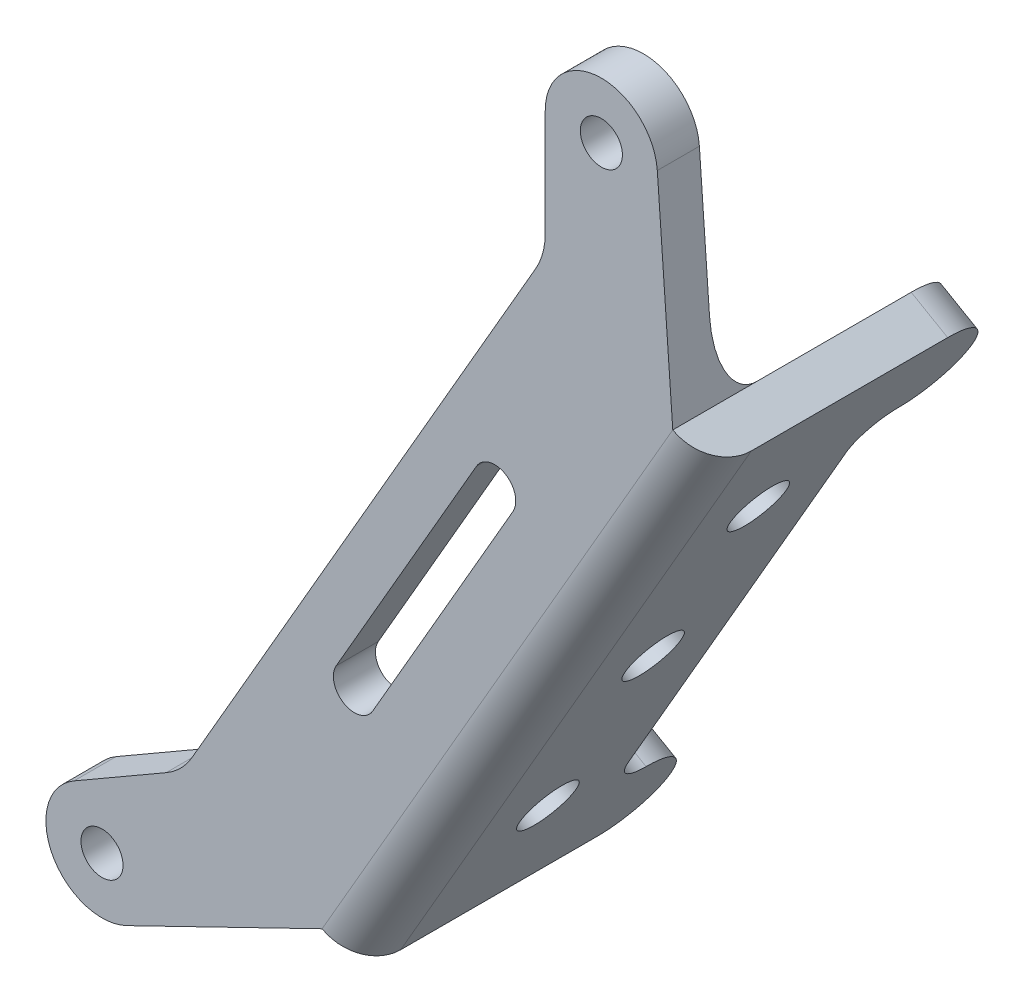
ISO-10303-21;
HEADER;
FILE_DESCRIPTION(('STEP AP214'),'2;1');
FILE_NAME('part.step','',(''),(''),'','','');
FILE_SCHEMA(('AUTOMOTIVE_DESIGN { 1 0 10303 214 1 1 1 1 }'));
ENDSEC;
DATA;
#1=APPLICATION_CONTEXT('core data for automotive mechanical design processes');
#2=APPLICATION_PROTOCOL_DEFINITION('international standard','automotive_design',2000,#1);
#3=PRODUCT_CONTEXT('',#1,'mechanical');
#4=PRODUCT('Part','Part','',(#3));
#5=PRODUCT_RELATED_PRODUCT_CATEGORY('part','',(#4));
#6=PRODUCT_DEFINITION_FORMATION('','',#4);
#7=PRODUCT_DEFINITION_CONTEXT('part definition',#1,'design');
#8=PRODUCT_DEFINITION('design','',#6,#7);
#9=PRODUCT_DEFINITION_SHAPE('','',#8);
#10=(LENGTH_UNIT() NAMED_UNIT(*) SI_UNIT(.MILLI.,.METRE.));
#11=(NAMED_UNIT(*) PLANE_ANGLE_UNIT() SI_UNIT($,.RADIAN.));
#12=(NAMED_UNIT(*) SI_UNIT($,.STERADIAN.) SOLID_ANGLE_UNIT());
#13=UNCERTAINTY_MEASURE_WITH_UNIT(LENGTH_MEASURE(1.E-05),#10,'distance_accuracy_value','');
#14=(GEOMETRIC_REPRESENTATION_CONTEXT(3) GLOBAL_UNCERTAINTY_ASSIGNED_CONTEXT((#13)) GLOBAL_UNIT_ASSIGNED_CONTEXT((#10,
#11,#12)) REPRESENTATION_CONTEXT('',''));
#15=CARTESIAN_POINT('',(0.,0.,0.));
#16=DIRECTION('',(0.,0.,1.));
#17=DIRECTION('',(1.,0.,0.));
#18=AXIS2_PLACEMENT_3D('',#15,#16,#17);
#19=CARTESIAN_POINT('',(104.927637922523,-60.5799999999992,0.));
#20=DIRECTION('',(0.866025403784442,-0.499999999999994,0.));
#21=DIRECTION('',(0.499999999999994,0.866025403784442,0.));
#22=AXIS2_PLACEMENT_3D('',#19,#20,#21);
#23=PLANE('',#22);
#24=CARTESIAN_POINT('',(97.427637922523,-73.5703810567659,-5.50000000000001));
#25=DIRECTION('',(0.866025403784442,-0.499999999999994,0.));
#26=DIRECTION('',(0.499999999999994,0.866025403784442,0.));
#27=AXIS2_PLACEMENT_3D('',#24,#25,#26);
#28=CIRCLE('',#27,2.);
#29=CARTESIAN_POINT('',(98.4276379225229,-71.838330249197,-5.50000000000001));
#30=VERTEX_POINT('',#29);
#31=EDGE_CURVE('E813',#30,#30,#28,.F.);
#32=ORIENTED_EDGE('',*,*,#31,.F.);
#33=EDGE_LOOP('',(#32));
#34=FACE_BOUND('',#33,.T.);
#35=CARTESIAN_POINT('',(104.927637922523,-60.5799999999992,-5.5));
#36=DIRECTION('',(0.866025403784442,-0.499999999999994,0.));
#37=DIRECTION('',(0.499999999999994,0.866025403784442,0.));
#38=AXIS2_PLACEMENT_3D('',#35,#36,#37);
#39=CIRCLE('',#38,2.);
#40=CARTESIAN_POINT('',(105.927637922523,-58.8479491924304,-5.5));
#41=VERTEX_POINT('',#40);
#42=EDGE_CURVE('E806',#41,#41,#39,.T.);
#43=ORIENTED_EDGE('',*,*,#42,.T.);
#44=EDGE_LOOP('',(#43));
#45=FACE_BOUND('',#44,.T.);
#46=CARTESIAN_POINT('',(112.427637922523,-47.5896189432326,-5.5));
#47=DIRECTION('',(0.866025403784442,-0.499999999999994,0.));
#48=DIRECTION('',(0.499999999999994,0.866025403784442,0.));
#49=AXIS2_PLACEMENT_3D('',#46,#47,#48);
#50=CIRCLE('',#49,2.);
#51=CARTESIAN_POINT('',(113.427637922523,-45.8575681356637,-5.5));
#52=VERTEX_POINT('',#51);
#53=EDGE_CURVE('E809',#52,#52,#50,.T.);
#54=ORIENTED_EDGE('',*,*,#53,.T.);
#55=EDGE_LOOP('',(#54));
#56=FACE_BOUND('',#55,.T.);
#57=CARTESIAN_POINT('',(115.677637922523,-41.9604538186336,-14.));
#58=DIRECTION('',(0.866025403784442,-0.499999999999994,0.));
#59=DIRECTION('',(0.499999999999994,0.866025403784442,0.));
#60=AXIS2_PLACEMENT_3D('',#57,#58,#59);
#61=CIRCLE('',#60,3.5);
#62=CARTESIAN_POINT('',(113.927637922523,-44.9915427318792,-14.));
#63=VERTEX_POINT('',#62);
#64=CARTESIAN_POINT('',(117.427637922523,-38.929364905388,-14.));
#65=VERTEX_POINT('',#64);
#66=EDGE_CURVE('E783',#63,#65,#61,.T.);
#67=ORIENTED_EDGE('',*,*,#66,.F.);
#68=CARTESIAN_POINT('',(112.677637922523,-47.1566062413403,-14.));
#69=DIRECTION('',(0.866025403784442,-0.499999999999994,0.));
#70=DIRECTION('',(0.499999999999994,0.866025403784442,0.));
#71=AXIS2_PLACEMENT_3D('',#68,#69,#70);
#72=CIRCLE('',#71,2.5);
#73=CARTESIAN_POINT('',(112.677637922523,-47.1566062413403,-11.5));
#74=VERTEX_POINT('',#73);
#75=EDGE_CURVE('E788',#63,#74,#72,.T.);
#76=ORIENTED_EDGE('',*,*,#75,.T.);
#77=DIRECTION('',(-0.499999999999994,-0.866025403784442,0.));
#78=VECTOR('',#77,1.);
#79=CARTESIAN_POINT('',(104.927637922523,-60.5799999999992,-11.5));
#80=LINE('',#79,#78);
#81=CARTESIAN_POINT('',(97.1776379225229,-74.0033937586582,-11.5));
#82=VERTEX_POINT('',#81);
#83=EDGE_CURVE('E817',#74,#82,#80,.T.);
#84=ORIENTED_EDGE('',*,*,#83,.T.);
#85=CARTESIAN_POINT('',(97.1776379225229,-74.0033937586582,-14.));
#86=DIRECTION('',(0.866025403784442,-0.499999999999994,0.));
#87=DIRECTION('',(0.499999999999994,0.866025403784442,0.));
#88=AXIS2_PLACEMENT_3D('',#85,#86,#87);
#89=CIRCLE('',#88,2.49999999999999);
#90=CARTESIAN_POINT('',(95.9276379225229,-76.1684572681193,-14.));
#91=VERTEX_POINT('',#90);
#92=EDGE_CURVE('E221',#91,#82,#89,.F.);
#93=ORIENTED_EDGE('',*,*,#92,.F.);
#94=CARTESIAN_POINT('',(94.1776379225229,-79.1995461813649,-14.));
#95=DIRECTION('',(0.866025403784442,-0.499999999999994,0.));
#96=DIRECTION('',(0.499999999999994,0.866025403784442,0.));
#97=AXIS2_PLACEMENT_3D('',#94,#95,#96);
#98=CIRCLE('',#97,3.5);
#99=CARTESIAN_POINT('',(92.427637922523,-82.2306350946102,-14.));
#100=VERTEX_POINT('',#99);
#101=EDGE_CURVE('E394',#91,#100,#98,.F.);
#102=ORIENTED_EDGE('',*,*,#101,.T.);
#103=DIRECTION('',(0.,0.,-1.));
#104=VECTOR('',#103,1.);
#105=CARTESIAN_POINT('',(92.427637922523,-82.2306350946102,3.));
#106=LINE('',#105,#104);
#107=CARTESIAN_POINT('',(92.427637922523,-82.2306350946102,-3.));
#108=VERTEX_POINT('',#107);
#109=EDGE_CURVE('E206',#108,#100,#106,.T.);
#110=ORIENTED_EDGE('',*,*,#109,.F.);
#111=DIRECTION('',(0.499999999999994,0.866025403784442,0.));
#112=VECTOR('',#111,1.);
#113=CARTESIAN_POINT('',(117.427637922523,-38.9293649053881,-3.));
#114=LINE('',#113,#112);
#115=CARTESIAN_POINT('',(117.427637922523,-38.929364905388,-3.));
#116=VERTEX_POINT('',#115);
#117=EDGE_CURVE('E328',#108,#116,#114,.T.);
#118=ORIENTED_EDGE('',*,*,#117,.T.);
#119=DIRECTION('',(0.,0.,1.));
#120=VECTOR('',#119,1.);
#121=CARTESIAN_POINT('',(117.427637922523,-38.9293649053881,3.));
#122=LINE('',#121,#120);
#123=EDGE_CURVE('E215',#65,#116,#122,.T.);
#124=ORIENTED_EDGE('',*,*,#123,.F.);
#125=EDGE_LOOP('',(#67,#76,#84,#93,#102,#110,#118,#124));
#126=FACE_BOUND('',#125,.T.);
#127=ADVANCED_FACE('F40',(#34,#45,#56,#126),#23,.F.);
#128=CARTESIAN_POINT('',(95.0257141338764,-83.7306350946102,3.));
#129=DIRECTION('',(0.499999999999994,0.866025403784442,0.));
#130=DIRECTION('',(-0.866025403784442,0.499999999999994,0.));
#131=AXIS2_PLACEMENT_3D('',#128,#129,#130);
#132=PLANE('',#131);
#133=DIRECTION('',(0.866025403784442,-0.499999999999994,0.));
#134=VECTOR('',#133,1.);
#135=CARTESIAN_POINT('',(50.6032822695408,-58.0833320996786,-14.));
#136=LINE('',#135,#134);
#137=CARTESIAN_POINT('',(95.0257141338764,-83.7306350946102,-14.));
#138=VERTEX_POINT('',#137);
#139=EDGE_CURVE('E190',#100,#138,#136,.T.);
#140=ORIENTED_EDGE('',*,*,#139,.T.);
#141=DIRECTION('',(0.,0.,-1.));
#142=VECTOR('',#141,1.);
#143=CARTESIAN_POINT('',(95.0257141338764,-83.7306350946102,3.));
#144=LINE('',#143,#142);
#145=CARTESIAN_POINT('',(95.0257141338764,-83.7306350946102,0.));
#146=VERTEX_POINT('',#145);
#147=EDGE_CURVE('E204',#146,#138,#144,.T.);
#148=ORIENTED_EDGE('',*,*,#147,.F.);
#149=CARTESIAN_POINT('',(92.427637922523,-82.2306350946102,0.));
#150=DIRECTION('',(0.499999999999994,0.866025403784442,0.));
#151=DIRECTION('',(-0.866025403784442,0.499999999999994,0.));
#152=AXIS2_PLACEMENT_3D('',#149,#150,#151);
#153=CIRCLE('',#152,3.);
#154=CARTESIAN_POINT('',(92.427637922523,-82.2306350946102,3.));
#155=VERTEX_POINT('',#154);
#156=EDGE_CURVE('E321',#146,#155,#153,.F.);
#157=ORIENTED_EDGE('',*,*,#156,.T.);
#158=DIRECTION('',(0.,0.,-1.));
#159=VECTOR('',#158,1.);
#160=CARTESIAN_POINT('',(92.427637922523,-82.2306350946102,3.));
#161=LINE('',#160,#159);
#162=EDGE_CURVE('E310',#155,#108,#161,.T.);
#163=ORIENTED_EDGE('',*,*,#162,.T.);
#164=ORIENTED_EDGE('',*,*,#109,.T.);
#165=EDGE_LOOP('',(#140,#148,#157,#163,#164));
#166=FACE_BOUND('',#165,.T.);
#167=ADVANCED_FACE('F203',(#166),#132,.F.);
#168=CARTESIAN_POINT('',(120.025714133876,-40.429364905388,3.));
#169=DIRECTION('',(-0.499999999999994,-0.866025403784442,0.));
#170=DIRECTION('',(0.866025403784442,-0.499999999999994,0.));
#171=AXIS2_PLACEMENT_3D('',#168,#169,#170);
#172=PLANE('',#171);
#173=DIRECTION('',(0.866025403784442,-0.499999999999994,0.));
#174=VECTOR('',#173,1.);
#175=CARTESIAN_POINT('',(75.6032822695405,-14.7820619104565,-14.));
#176=LINE('',#175,#174);
#177=CARTESIAN_POINT('',(120.025714133876,-40.4293649053881,-14.));
#178=VERTEX_POINT('',#177);
#179=EDGE_CURVE('E207',#65,#178,#176,.T.);
#180=ORIENTED_EDGE('',*,*,#179,.F.);
#181=ORIENTED_EDGE('',*,*,#123,.T.);
#182=DIRECTION('',(0.,0.,-1.));
#183=VECTOR('',#182,1.);
#184=CARTESIAN_POINT('',(117.427637922523,-38.929364905388,3.));
#185=LINE('',#184,#183);
#186=CARTESIAN_POINT('',(117.427637922523,-38.929364905388,3.));
#187=VERTEX_POINT('',#186);
#188=EDGE_CURVE('E307',#187,#116,#185,.T.);
#189=ORIENTED_EDGE('',*,*,#188,.F.);
#190=CARTESIAN_POINT('',(117.427637922523,-38.9293649053881,0.));
#191=DIRECTION('',(-0.499999999999994,-0.866025403784442,0.));
#192=DIRECTION('',(0.866025403784442,-0.499999999999994,0.));
#193=AXIS2_PLACEMENT_3D('',#190,#191,#192);
#194=CIRCLE('',#193,3.);
#195=CARTESIAN_POINT('',(120.025714133876,-40.429364905388,0.));
#196=VERTEX_POINT('',#195);
#197=EDGE_CURVE('E325',#187,#196,#194,.F.);
#198=ORIENTED_EDGE('',*,*,#197,.T.);
#199=DIRECTION('',(0.,0.,1.));
#200=VECTOR('',#199,1.);
#201=CARTESIAN_POINT('',(120.025714133876,-40.429364905388,3.));
#202=LINE('',#201,#200);
#203=EDGE_CURVE('E214',#178,#196,#202,.T.);
#204=ORIENTED_EDGE('',*,*,#203,.F.);
#205=EDGE_LOOP('',(#180,#181,#189,#198,#204));
#206=FACE_BOUND('',#205,.T.);
#207=ADVANCED_FACE('F408',(#206),#172,.F.);
#208=CARTESIAN_POINT('',(107.525714133876,-62.0799999999992,0.));
#209=DIRECTION('',(0.866025403784442,-0.499999999999994,0.));
#210=DIRECTION('',(0.499999999999994,0.866025403784442,0.));
#211=AXIS2_PLACEMENT_3D('',#208,#209,#210);
#212=PLANE('',#211);
#213=CARTESIAN_POINT('',(107.525714133876,-62.0799999999993,-5.5));
#214=DIRECTION('',(0.866025403784442,-0.499999999999994,0.));
#215=DIRECTION('',(0.499999999999994,0.866025403784442,0.));
#216=AXIS2_PLACEMENT_3D('',#213,#214,#215);
#217=CIRCLE('',#216,2.);
#218=CARTESIAN_POINT('',(108.525714133876,-60.3479491924304,-5.5));
#219=VERTEX_POINT('',#218);
#220=EDGE_CURVE('E800',#219,#219,#217,.T.);
#221=ORIENTED_EDGE('',*,*,#220,.F.);
#222=EDGE_LOOP('',(#221));
#223=FACE_BOUND('',#222,.T.);
#224=CARTESIAN_POINT('',(115.025714133876,-49.0896189432326,-5.5));
#225=DIRECTION('',(0.866025403784442,-0.499999999999994,0.));
#226=DIRECTION('',(0.499999999999994,0.866025403784442,0.));
#227=AXIS2_PLACEMENT_3D('',#224,#225,#226);
#228=CIRCLE('',#227,2.);
#229=CARTESIAN_POINT('',(116.025714133876,-47.3575681356638,-5.5));
#230=VERTEX_POINT('',#229);
#231=EDGE_CURVE('E803',#230,#230,#228,.T.);
#232=ORIENTED_EDGE('',*,*,#231,.F.);
#233=EDGE_LOOP('',(#232));
#234=FACE_BOUND('',#233,.T.);
#235=CARTESIAN_POINT('',(100.025714133876,-75.0703810567659,-5.50000000000001));
#236=DIRECTION('',(0.866025403784442,-0.499999999999994,0.));
#237=DIRECTION('',(0.499999999999994,0.866025403784442,0.));
#238=AXIS2_PLACEMENT_3D('',#235,#236,#237);
#239=CIRCLE('',#238,2.);
#240=CARTESIAN_POINT('',(101.025714133876,-73.338330249197,-5.50000000000001));
#241=VERTEX_POINT('',#240);
#242=EDGE_CURVE('E797',#241,#241,#239,.F.);
#243=ORIENTED_EDGE('',*,*,#242,.T.);
#244=EDGE_LOOP('',(#243));
#245=FACE_BOUND('',#244,.T.);
#246=CARTESIAN_POINT('',(115.275714133876,-48.6566062413403,-14.));
#247=DIRECTION('',(0.866025403784442,-0.499999999999994,0.));
#248=DIRECTION('',(0.499999999999994,0.866025403784442,0.));
#249=AXIS2_PLACEMENT_3D('',#246,#247,#248);
#250=CIRCLE('',#249,2.5);
#251=CARTESIAN_POINT('',(116.525714133876,-46.4915427318792,-14.));
#252=VERTEX_POINT('',#251);
#253=CARTESIAN_POINT('',(115.275714133876,-48.6566062413403,-11.5));
#254=VERTEX_POINT('',#253);
#255=EDGE_CURVE('E826',#252,#254,#250,.T.);
#256=ORIENTED_EDGE('',*,*,#255,.F.);
#257=CARTESIAN_POINT('',(118.275714133876,-43.4604538186337,-14.));
#258=DIRECTION('',(0.866025403784442,-0.499999999999994,0.));
#259=DIRECTION('',(0.499999999999994,0.866025403784442,0.));
#260=AXIS2_PLACEMENT_3D('',#257,#258,#259);
#261=CIRCLE('',#260,3.5);
#262=EDGE_CURVE('E197',#252,#178,#261,.T.);
#263=ORIENTED_EDGE('',*,*,#262,.T.);
#264=ORIENTED_EDGE('',*,*,#203,.T.);
#265=DIRECTION('',(-0.499999999999994,-0.866025403784442,0.));
#266=VECTOR('',#265,1.);
#267=CARTESIAN_POINT('',(107.525714133876,-62.0799999999992,0.));
#268=LINE('',#267,#266);
#269=EDGE_CURVE('E213',#196,#146,#268,.T.);
#270=ORIENTED_EDGE('',*,*,#269,.T.);
#271=ORIENTED_EDGE('',*,*,#147,.T.);
#272=CARTESIAN_POINT('',(96.7757141338763,-80.6995461813649,-14.));
#273=DIRECTION('',(0.866025403784442,-0.499999999999994,0.));
#274=DIRECTION('',(0.499999999999994,0.866025403784442,0.));
#275=AXIS2_PLACEMENT_3D('',#272,#273,#274);
#276=CIRCLE('',#275,3.5);
#277=CARTESIAN_POINT('',(98.5257141338762,-77.6684572681193,-14.));
#278=VERTEX_POINT('',#277);
#279=EDGE_CURVE('E187',#278,#138,#276,.F.);
#280=ORIENTED_EDGE('',*,*,#279,.F.);
#281=CARTESIAN_POINT('',(99.7757141338763,-75.5033937586582,-14.));
#282=DIRECTION('',(0.866025403784442,-0.499999999999994,0.));
#283=DIRECTION('',(0.499999999999994,0.866025403784442,0.));
#284=AXIS2_PLACEMENT_3D('',#281,#282,#283);
#285=CIRCLE('',#284,2.49999999999999);
#286=CARTESIAN_POINT('',(99.7757141338763,-75.5033937586582,-11.5));
#287=VERTEX_POINT('',#286);
#288=EDGE_CURVE('E198',#278,#287,#285,.F.);
#289=ORIENTED_EDGE('',*,*,#288,.T.);
#290=DIRECTION('',(-0.499999999999994,-0.866025403784442,0.));
#291=VECTOR('',#290,1.);
#292=CARTESIAN_POINT('',(107.525714133876,-62.0799999999993,-11.5));
#293=LINE('',#292,#291);
#294=EDGE_CURVE('E796',#254,#287,#293,.T.);
#295=ORIENTED_EDGE('',*,*,#294,.F.);
#296=EDGE_LOOP('',(#256,#263,#264,#270,#271,#280,#289,#295));
#297=FACE_BOUND('',#296,.T.);
#298=ADVANCED_FACE('F211',(#223,#234,#245,#297),#212,.T.);
#299=CARTESIAN_POINT('',(112.335333077109,-23.7494956252739,3.));
#300=DIRECTION('',(0.,0.,-1.));
#301=DIRECTION('',(-1.,0.,0.));
#302=AXIS2_PLACEMENT_3D('',#299,#300,#301);
#303=CYLINDRICAL_SURFACE('',#302,4.00000000000038);
#304=CARTESIAN_POINT('',(112.335333077109,-23.7494956252739,0.));
#305=DIRECTION('',(0.,0.,1.));
#306=DIRECTION('',(1.,0.,0.));
#307=AXIS2_PLACEMENT_3D('',#304,#305,#306);
#308=CIRCLE('',#307,4.00000000000038);
#309=CARTESIAN_POINT('',(116.325207489836,-23.465062556394,0.));
#310=VERTEX_POINT('',#309);
#311=CARTESIAN_POINT('',(108.335333077109,-23.7494956252723,0.));
#312=VERTEX_POINT('',#311);
#313=EDGE_CURVE('E286',#310,#312,#308,.T.);
#314=ORIENTED_EDGE('',*,*,#313,.T.);
#315=DIRECTION('',(0.,0.,-1.));
#316=VECTOR('',#315,1.);
#317=CARTESIAN_POINT('',(108.335333077109,-23.7494956252723,3.));
#318=LINE('',#317,#316);
#319=CARTESIAN_POINT('',(108.335333077109,-23.7494956252723,3.));
#320=VERTEX_POINT('',#319);
#321=EDGE_CURVE('E317',#320,#312,#318,.T.);
#322=ORIENTED_EDGE('',*,*,#321,.F.);
#323=CARTESIAN_POINT('',(112.335333077109,-23.7494956252739,3.));
#324=DIRECTION('',(0.,0.,1.));
#325=DIRECTION('',(1.,0.,0.));
#326=AXIS2_PLACEMENT_3D('',#323,#324,#325);
#327=CIRCLE('',#326,4.00000000000038);
#328=CARTESIAN_POINT('',(116.325207489836,-23.465062556394,3.));
#329=VERTEX_POINT('',#328);
#330=EDGE_CURVE('E260',#329,#320,#327,.T.);
#331=ORIENTED_EDGE('',*,*,#330,.F.);
#332=DIRECTION('',(0.,0.,-1.));
#333=VECTOR('',#332,1.);
#334=CARTESIAN_POINT('',(116.325207489836,-23.465062556394,3.));
#335=LINE('',#334,#333);
#336=EDGE_CURVE('E283',#329,#310,#335,.T.);
#337=ORIENTED_EDGE('',*,*,#336,.T.);
#338=EDGE_LOOP('',(#314,#322,#331,#337));
#339=FACE_BOUND('',#338,.T.);
#340=ADVANCED_FACE('F379',(#339),#303,.T.);
#341=CARTESIAN_POINT('',(108.33533307711,3.36787755779306E-13,3.));
#342=DIRECTION('',(1.,0.,0.));
#343=DIRECTION('',(0.,1.,0.));
#344=AXIS2_PLACEMENT_3D('',#341,#342,#343);
#345=PLANE('',#344);
#346=DIRECTION('',(0.,-1.,0.));
#347=VECTOR('',#346,1.);
#348=CARTESIAN_POINT('',(108.33533307711,3.36787755779306E-13,0.));
#349=LINE('',#348,#347);
#350=CARTESIAN_POINT('',(108.33533307711,-31.3379528933923,0.));
#351=VERTEX_POINT('',#350);
#352=EDGE_CURVE('E289',#312,#351,#349,.T.);
#353=ORIENTED_EDGE('',*,*,#352,.T.);
#354=DIRECTION('',(0.,0.,-1.));
#355=VECTOR('',#354,1.);
#356=CARTESIAN_POINT('',(108.33533307711,-31.3379528933923,3.));
#357=LINE('',#356,#355);
#358=CARTESIAN_POINT('',(108.33533307711,-31.3379528933923,3.));
#359=VERTEX_POINT('',#358);
#360=EDGE_CURVE('E55',#351,#359,#357,.F.);
#361=ORIENTED_EDGE('',*,*,#360,.T.);
#362=DIRECTION('',(0.,-1.,0.));
#363=VECTOR('',#362,1.);
#364=CARTESIAN_POINT('',(108.33533307711,3.36787755779306E-13,3.));
#365=LINE('',#364,#363);
#366=EDGE_CURVE('E264',#320,#359,#365,.T.);
#367=ORIENTED_EDGE('',*,*,#366,.F.);
#368=ORIENTED_EDGE('',*,*,#321,.T.);
#369=EDGE_LOOP('',(#353,#361,#367,#368));
#370=FACE_BOUND('',#369,.T.);
#371=ADVANCED_FACE('F376',(#370),#345,.F.);
#372=CARTESIAN_POINT('',(95.401358480894,-55.0799999999991,3.));
#373=DIRECTION('',(-0.866025403784442,0.499999999999993,0.));
#374=DIRECTION('',(-0.499999999999993,-0.866025403784442,0.));
#375=AXIS2_PLACEMENT_3D('',#372,#373,#374);
#376=PLANE('',#375);
#377=DIRECTION('',(0.499999999999993,0.866025403784442,0.));
#378=VECTOR('',#377,1.);
#379=CARTESIAN_POINT('',(95.401358480894,-55.0799999999991,0.));
#380=LINE('',#379,#378);
#381=CARTESIAN_POINT('',(83.1372568657559,-76.3220471066061,0.));
#382=VERTEX_POINT('',#381);
#383=CARTESIAN_POINT('',(107.665460096032,-33.8379528933923,0.));
#384=VERTEX_POINT('',#383);
#385=EDGE_CURVE('E291',#382,#384,#380,.T.);
#386=ORIENTED_EDGE('',*,*,#385,.F.);
#387=DIRECTION('',(0.,0.,-1.));
#388=VECTOR('',#387,1.);
#389=CARTESIAN_POINT('',(83.1372568657559,-76.3220471066061,3.));
#390=LINE('',#389,#388);
#391=CARTESIAN_POINT('',(83.1372568657559,-76.3220471066061,3.));
#392=VERTEX_POINT('',#391);
#393=EDGE_CURVE('E344',#382,#392,#390,.F.);
#394=ORIENTED_EDGE('',*,*,#393,.T.);
#395=DIRECTION('',(0.499999999999993,0.866025403784442,0.));
#396=VECTOR('',#395,1.);
#397=CARTESIAN_POINT('',(95.401358480894,-55.0799999999991,3.));
#398=LINE('',#397,#396);
#399=CARTESIAN_POINT('',(107.665460096032,-33.8379528933923,3.));
#400=VERTEX_POINT('',#399);
#401=EDGE_CURVE('E266',#392,#400,#398,.T.);
#402=ORIENTED_EDGE('',*,*,#401,.T.);
#403=DIRECTION('',(0.,0.,-1.));
#404=VECTOR('',#403,1.);
#405=CARTESIAN_POINT('',(107.665460096032,-33.8379528933923,3.));
#406=LINE('',#405,#404);
#407=EDGE_CURVE('E341',#400,#384,#406,.T.);
#408=ORIENTED_EDGE('',*,*,#407,.T.);
#409=EDGE_LOOP('',(#386,#394,#402,#408));
#410=FACE_BOUND('',#409,.T.);
#411=ADVANCED_FACE('F369',(#410),#376,.T.);
#412=CARTESIAN_POINT('',(54.1676665385556,-93.821150572225,3.));
#413=DIRECTION('',(-0.500000000000007,0.866025403784434,0.));
#414=DIRECTION('',(-0.866025403784434,-0.500000000000008,0.));
#415=AXIS2_PLACEMENT_3D('',#412,#413,#414);
#416=PLANE('',#415);
#417=DIRECTION('',(0.866025403784434,0.500000000000008,0.));
#418=VECTOR('',#417,1.);
#419=CARTESIAN_POINT('',(54.1676665385556,-93.821150572225,3.));
#420=LINE('',#419,#418);
#421=CARTESIAN_POINT('',(74.7353330771093,-81.9464027595883,3.));
#422=VERTEX_POINT('',#421);
#423=CARTESIAN_POINT('',(81.3071298468337,-78.1521741255283,3.));
#424=VERTEX_POINT('',#423);
#425=EDGE_CURVE('E269',#422,#424,#420,.T.);
#426=ORIENTED_EDGE('',*,*,#425,.T.);
#427=DIRECTION('',(0.,0.,-1.));
#428=VECTOR('',#427,1.);
#429=CARTESIAN_POINT('',(81.3071298468337,-78.1521741255283,0.));
#430=LINE('',#429,#428);
#431=CARTESIAN_POINT('',(81.3071298468337,-78.1521741255283,0.));
#432=VERTEX_POINT('',#431);
#433=EDGE_CURVE('E338',#424,#432,#430,.T.);
#434=ORIENTED_EDGE('',*,*,#433,.T.);
#435=DIRECTION('',(0.866025403784434,0.500000000000008,0.));
#436=VECTOR('',#435,1.);
#437=CARTESIAN_POINT('',(54.1676665385556,-93.821150572225,0.));
#438=LINE('',#437,#436);
#439=CARTESIAN_POINT('',(74.7353330771093,-81.9464027595883,0.));
#440=VERTEX_POINT('',#439);
#441=EDGE_CURVE('E293',#440,#432,#438,.T.);
#442=ORIENTED_EDGE('',*,*,#441,.F.);
#443=DIRECTION('',(0.,0.,-1.));
#444=VECTOR('',#443,1.);
#445=CARTESIAN_POINT('',(74.7353330771093,-81.9464027595883,3.));
#446=LINE('',#445,#444);
#447=EDGE_CURVE('E315',#422,#440,#446,.T.);
#448=ORIENTED_EDGE('',*,*,#447,.F.);
#449=EDGE_LOOP('',(#426,#434,#442,#448));
#450=FACE_BOUND('',#449,.T.);
#451=ADVANCED_FACE('F360',(#450),#416,.T.);
#452=CARTESIAN_POINT('',(76.7353330771093,-85.410504374726,3.));
#453=DIRECTION('',(0.,0.,-1.));
#454=DIRECTION('',(-1.,0.,0.));
#455=AXIS2_PLACEMENT_3D('',#452,#453,#454);
#456=CYLINDRICAL_SURFACE('',#455,4.00000000000001);
#457=CARTESIAN_POINT('',(76.7353330771093,-85.410504374726,0.));
#458=DIRECTION('',(0.,0.,1.));
#459=DIRECTION('',(1.,0.,0.));
#460=AXIS2_PLACEMENT_3D('',#457,#458,#459);
#461=CIRCLE('',#460,4.00000000000001);
#462=CARTESIAN_POINT('',(78.4839440201475,-89.0080535084957,0.));
#463=VERTEX_POINT('',#462);
#464=EDGE_CURVE('E296',#440,#463,#461,.T.);
#465=ORIENTED_EDGE('',*,*,#464,.T.);
#466=DIRECTION('',(0.,0.,-1.));
#467=VECTOR('',#466,1.);
#468=CARTESIAN_POINT('',(78.4839440201475,-89.0080535084957,3.));
#469=LINE('',#468,#467);
#470=CARTESIAN_POINT('',(78.4839440201475,-89.0080535084957,3.));
#471=VERTEX_POINT('',#470);
#472=EDGE_CURVE('E312',#471,#463,#469,.T.);
#473=ORIENTED_EDGE('',*,*,#472,.F.);
#474=CARTESIAN_POINT('',(76.7353330771093,-85.410504374726,3.));
#475=DIRECTION('',(0.,0.,1.));
#476=DIRECTION('',(1.,0.,0.));
#477=AXIS2_PLACEMENT_3D('',#474,#475,#476);
#478=CIRCLE('',#477,4.00000000000001);
#479=EDGE_CURVE('E272',#422,#471,#478,.T.);
#480=ORIENTED_EDGE('',*,*,#479,.F.);
#481=ORIENTED_EDGE('',*,*,#447,.T.);
#482=EDGE_LOOP('',(#465,#473,#480,#481));
#483=FACE_BOUND('',#482,.T.);
#484=ADVANCED_FACE('F403',(#483),#456,.T.);
#485=CARTESIAN_POINT('',(49.9937408559912,-102.855892459349,3.));
#486=DIRECTION('',(-0.437152735759549,0.899387283442423,0.));
#487=DIRECTION('',(-0.899387283442423,-0.437152735759549,0.));
#488=AXIS2_PLACEMENT_3D('',#485,#486,#487);
#489=PLANE('',#488);
#490=DIRECTION('',(0.899387283442424,0.437152735759549,0.));
#491=VECTOR('',#490,1.);
#492=CARTESIAN_POINT('',(49.9937408559912,-102.855892459349,0.));
#493=LINE('',#492,#491);
#494=CARTESIAN_POINT('',(87.612207899559,-84.5712045546765,0.));
#495=VERTEX_POINT('',#494);
#496=EDGE_CURVE('E298',#463,#495,#493,.T.);
#497=ORIENTED_EDGE('',*,*,#496,.T.);
#498=CARTESIAN_POINT('',(87.612207899559,-84.5712045546765,-3.));
#499=DIRECTION('',(-0.437152735759549,0.899387283442423,0.));
#500=DIRECTION('',(-0.899387283442423,-0.437152735759549,0.));
#501=AXIS2_PLACEMENT_3D('',#498,#499,#500);
#502=ELLIPSE('',#501,5.35412286966401,3.);
#503=EDGE_CURVE('E335',#495,#108,#502,.T.);
#504=ORIENTED_EDGE('',*,*,#503,.T.);
#505=ORIENTED_EDGE('',*,*,#162,.F.);
#506=DIRECTION('',(0.899387283442424,0.437152735759549,0.));
#507=VECTOR('',#506,1.);
#508=CARTESIAN_POINT('',(49.9937408559912,-102.855892459349,3.));
#509=LINE('',#508,#507);
#510=EDGE_CURVE('E274',#471,#155,#509,.T.);
#511=ORIENTED_EDGE('',*,*,#510,.F.);
#512=ORIENTED_EDGE('',*,*,#472,.T.);
#513=EDGE_LOOP('',(#497,#504,#505,#511,#512));
#514=FACE_BOUND('',#513,.T.);
#515=ADVANCED_FACE('F397',(#514),#489,.F.);
#516=CARTESIAN_POINT('',(114.072686226712,8.13209661817183,3.));
#517=DIRECTION('',(0.997468603181588,0.0711082672195906,0.));
#518=DIRECTION('',(-0.0711082672195906,0.997468603181588,0.));
#519=AXIS2_PLACEMENT_3D('',#516,#517,#518);
#520=PLANE('',#519);
#521=DIRECTION('',(0.0711082672195906,-0.997468603181587,0.));
#522=VECTOR('',#521,1.);
#523=CARTESIAN_POINT('',(114.072686226712,8.13209661817183,0.));
#524=LINE('',#523,#522);
#525=CARTESIAN_POINT('',(117.04691552278,-33.5887954453219,0.));
#526=VERTEX_POINT('',#525);
#527=EDGE_CURVE('E301',#310,#526,#524,.T.);
#528=ORIENTED_EDGE('',*,*,#527,.F.);
#529=ORIENTED_EDGE('',*,*,#336,.F.);
#530=DIRECTION('',(0.0711082672195906,-0.997468603181587,0.));
#531=VECTOR('',#530,1.);
#532=CARTESIAN_POINT('',(114.072686226712,8.13209661817183,3.));
#533=LINE('',#532,#531);
#534=EDGE_CURVE('E277',#329,#187,#533,.T.);
#535=ORIENTED_EDGE('',*,*,#534,.T.);
#536=ORIENTED_EDGE('',*,*,#188,.T.);
#537=CARTESIAN_POINT('',(117.04691552278,-33.5887954453219,-3.));
#538=DIRECTION('',(0.997468603181588,0.0711082672195906,0.));
#539=DIRECTION('',(0.0711082672195906,-0.997468603181587,0.));
#540=AXIS2_PLACEMENT_3D('',#537,#538,#539);
#541=ELLIPSE('',#540,5.354122869664,3.);
#542=EDGE_CURVE('E333',#116,#526,#541,.F.);
#543=ORIENTED_EDGE('',*,*,#542,.T.);
#544=EDGE_LOOP('',(#528,#529,#535,#536,#543));
#545=FACE_BOUND('',#544,.T.);
#546=ADVANCED_FACE('F383',(#545),#520,.T.);
#547=CARTESIAN_POINT('',(112.335333077109,-23.7494956252739,3.));
#548=DIRECTION('',(0.,0.,-1.));
#549=DIRECTION('',(-1.,0.,0.));
#550=AXIS2_PLACEMENT_3D('',#547,#548,#549);
#551=CYLINDRICAL_SURFACE('',#550,1.5);
#552=CARTESIAN_POINT('',(112.335333077109,-23.7494956252739,3.));
#553=DIRECTION('',(0.,0.,1.));
#554=DIRECTION('',(1.,0.,0.));
#555=AXIS2_PLACEMENT_3D('',#552,#553,#554);
#556=CIRCLE('',#555,1.5);
#557=CARTESIAN_POINT('',(113.835333077109,-23.7494956252739,3.));
#558=VERTEX_POINT('',#557);
#559=EDGE_CURVE('E257',#558,#558,#556,.T.);
#560=ORIENTED_EDGE('',*,*,#559,.T.);
#561=EDGE_LOOP('',(#560));
#562=FACE_BOUND('',#561,.T.);
#563=CARTESIAN_POINT('',(112.335333077109,-23.7494956252739,0.));
#564=DIRECTION('',(0.,0.,1.));
#565=DIRECTION('',(1.,0.,0.));
#566=AXIS2_PLACEMENT_3D('',#563,#564,#565);
#567=CIRCLE('',#566,1.5);
#568=CARTESIAN_POINT('',(113.835333077109,-23.7494956252739,0.));
#569=VERTEX_POINT('',#568);
#570=EDGE_CURVE('E250',#569,#569,#567,.T.);
#571=ORIENTED_EDGE('',*,*,#570,.F.);
#572=EDGE_LOOP('',(#571));
#573=FACE_BOUND('',#572,.T.);
#574=ADVANCED_FACE('F458',(#562,#573),#551,.F.);
#575=CARTESIAN_POINT('',(76.7353330771093,-85.410504374726,3.));
#576=DIRECTION('',(0.,0.,-1.));
#577=DIRECTION('',(-1.,0.,0.));
#578=AXIS2_PLACEMENT_3D('',#575,#576,#577);
#579=CYLINDRICAL_SURFACE('',#578,1.5);
#580=CARTESIAN_POINT('',(76.7353330771093,-85.410504374726,3.));
#581=DIRECTION('',(0.,0.,1.));
#582=DIRECTION('',(1.,0.,0.));
#583=AXIS2_PLACEMENT_3D('',#580,#581,#582);
#584=CIRCLE('',#583,1.5);
#585=CARTESIAN_POINT('',(78.2353330771093,-85.410504374726,3.));
#586=VERTEX_POINT('',#585);
#587=EDGE_CURVE('E280',#586,#586,#584,.T.);
#588=ORIENTED_EDGE('',*,*,#587,.T.);
#589=EDGE_LOOP('',(#588));
#590=FACE_BOUND('',#589,.T.);
#591=CARTESIAN_POINT('',(76.7353330771093,-85.410504374726,0.));
#592=DIRECTION('',(0.,0.,1.));
#593=DIRECTION('',(1.,0.,0.));
#594=AXIS2_PLACEMENT_3D('',#591,#592,#593);
#595=CIRCLE('',#594,1.5);
#596=CARTESIAN_POINT('',(78.2353330771093,-85.410504374726,0.));
#597=VERTEX_POINT('',#596);
#598=EDGE_CURVE('E261',#597,#597,#595,.T.);
#599=ORIENTED_EDGE('',*,*,#598,.F.);
#600=EDGE_LOOP('',(#599));
#601=FACE_BOUND('',#600,.T.);
#602=ADVANCED_FACE('F451',(#590,#601),#579,.F.);
#603=CARTESIAN_POINT('',(0.,0.,3.));
#604=DIRECTION('',(0.,0.,1.));
#605=DIRECTION('',(1.,0.,0.));
#606=AXIS2_PLACEMENT_3D('',#603,#604,#605);
#607=PLANE('',#606);
#608=CARTESIAN_POINT('',(94.7314854998164,-66.2402540378436,3.));
#609=DIRECTION('',(0.,0.,1.));
#610=DIRECTION('',(1.,0.,0.));
#611=AXIS2_PLACEMENT_3D('',#608,#609,#610);
#612=CIRCLE('',#611,1.50000000000002);
#613=CARTESIAN_POINT('',(93.4324473941397,-65.4902540378436,3.));
#614=VERTEX_POINT('',#613);
#615=CARTESIAN_POINT('',(96.0305236054931,-66.9902540378436,3.));
#616=VERTEX_POINT('',#615);
#617=EDGE_CURVE('E217',#614,#616,#612,.T.);
#618=ORIENTED_EDGE('',*,*,#617,.F.);
#619=DIRECTION('',(-0.5,-0.866025403784439,0.));
#620=VECTOR('',#619,1.);
#621=CARTESIAN_POINT('',(93.4324473941397,-65.4902540378436,3.));
#622=LINE('',#621,#620);
#623=CARTESIAN_POINT('',(103.43244739414,-48.1697459621548,3.));
#624=VERTEX_POINT('',#623);
#625=EDGE_CURVE('E229',#624,#614,#622,.T.);
#626=ORIENTED_EDGE('',*,*,#625,.F.);
#627=CARTESIAN_POINT('',(104.731485499816,-48.9197459621548,3.));
#628=DIRECTION('',(0.,0.,1.));
#629=DIRECTION('',(1.,0.,0.));
#630=AXIS2_PLACEMENT_3D('',#627,#628,#629);
#631=CIRCLE('',#630,1.50000000000002);
#632=CARTESIAN_POINT('',(106.030523605493,-49.6697459621548,3.));
#633=VERTEX_POINT('',#632);
#634=EDGE_CURVE('E243',#633,#624,#631,.T.);
#635=ORIENTED_EDGE('',*,*,#634,.F.);
#636=DIRECTION('',(0.5,0.866025403784439,0.));
#637=VECTOR('',#636,1.);
#638=CARTESIAN_POINT('',(96.030523605493,-66.9902540378436,3.));
#639=LINE('',#638,#637);
#640=EDGE_CURVE('E240',#616,#633,#639,.T.);
#641=ORIENTED_EDGE('',*,*,#640,.F.);
#642=EDGE_LOOP('',(#618,#626,#635,#641));
#643=FACE_BOUND('',#642,.T.);
#644=ORIENTED_EDGE('',*,*,#559,.F.);
#645=EDGE_LOOP('',(#644));
#646=FACE_BOUND('',#645,.T.);
#647=ORIENTED_EDGE('',*,*,#510,.T.);
#648=DIRECTION('',(-0.499999999999994,-0.866025403784442,0.));
#649=VECTOR('',#648,1.);
#650=CARTESIAN_POINT('',(104.927637922523,-60.5799999999992,3.));
#651=LINE('',#650,#649);
#652=EDGE_CURVE('E323',#155,#187,#651,.F.);
#653=ORIENTED_EDGE('',*,*,#652,.T.);
#654=ORIENTED_EDGE('',*,*,#534,.F.);
#655=ORIENTED_EDGE('',*,*,#330,.T.);
#656=ORIENTED_EDGE('',*,*,#366,.T.);
#657=CARTESIAN_POINT('',(103.33533307711,-31.3379528933923,3.));
#658=DIRECTION('',(0.,0.,1.));
#659=DIRECTION('',(1.,0.,0.));
#660=AXIS2_PLACEMENT_3D('',#657,#658,#659);
#661=CIRCLE('',#660,5.);
#662=EDGE_CURVE('E11',#359,#400,#661,.F.);
#663=ORIENTED_EDGE('',*,*,#662,.T.);
#664=ORIENTED_EDGE('',*,*,#401,.F.);
#665=CARTESIAN_POINT('',(78.8071298468337,-73.8220471066061,3.));
#666=DIRECTION('',(0.,0.,1.));
#667=DIRECTION('',(1.,0.,0.));
#668=AXIS2_PLACEMENT_3D('',#665,#666,#667);
#669=CIRCLE('',#668,5.);
#670=EDGE_CURVE('E349',#392,#424,#669,.F.);
#671=ORIENTED_EDGE('',*,*,#670,.T.);
#672=ORIENTED_EDGE('',*,*,#425,.F.);
#673=ORIENTED_EDGE('',*,*,#479,.T.);
#674=EDGE_LOOP('',(#647,#653,#654,#655,#656,#663,#664,#671,#672,#673));
#675=FACE_BOUND('',#674,.T.);
#676=ORIENTED_EDGE('',*,*,#587,.F.);
#677=EDGE_LOOP('',(#676));
#678=FACE_BOUND('',#677,.T.);
#679=ADVANCED_FACE('F354',(#643,#646,#675,#678),#607,.T.);
#680=CARTESIAN_POINT('',(0.,0.,0.));
#681=DIRECTION('',(0.,0.,1.));
#682=DIRECTION('',(1.,0.,0.));
#683=AXIS2_PLACEMENT_3D('',#680,#681,#682);
#684=PLANE('',#683);
#685=DIRECTION('',(-0.5,-0.866025403784439,0.));
#686=VECTOR('',#685,1.);
#687=CARTESIAN_POINT('',(93.4324473941397,-65.4902540378436,0.));
#688=LINE('',#687,#686);
#689=CARTESIAN_POINT('',(103.43244739414,-48.1697459621548,0.));
#690=VERTEX_POINT('',#689);
#691=CARTESIAN_POINT('',(93.4324473941397,-65.4902540378436,0.));
#692=VERTEX_POINT('',#691);
#693=EDGE_CURVE('E235',#690,#692,#688,.T.);
#694=ORIENTED_EDGE('',*,*,#693,.T.);
#695=CARTESIAN_POINT('',(94.7314854998164,-66.2402540378436,0.));
#696=DIRECTION('',(0.,0.,1.));
#697=DIRECTION('',(1.,0.,0.));
#698=AXIS2_PLACEMENT_3D('',#695,#696,#697);
#699=CIRCLE('',#698,1.50000000000002);
#700=CARTESIAN_POINT('',(96.030523605493,-66.9902540378436,0.));
#701=VERTEX_POINT('',#700);
#702=EDGE_CURVE('E225',#692,#701,#699,.T.);
#703=ORIENTED_EDGE('',*,*,#702,.T.);
#704=DIRECTION('',(0.5,0.866025403784439,0.));
#705=VECTOR('',#704,1.);
#706=CARTESIAN_POINT('',(96.030523605493,-66.9902540378436,0.));
#707=LINE('',#706,#705);
#708=CARTESIAN_POINT('',(106.030523605493,-49.6697459621548,0.));
#709=VERTEX_POINT('',#708);
#710=EDGE_CURVE('E228',#701,#709,#707,.T.);
#711=ORIENTED_EDGE('',*,*,#710,.T.);
#712=CARTESIAN_POINT('',(104.731485499816,-48.9197459621548,0.));
#713=DIRECTION('',(0.,0.,1.));
#714=DIRECTION('',(1.,0.,0.));
#715=AXIS2_PLACEMENT_3D('',#712,#713,#714);
#716=CIRCLE('',#715,1.50000000000002);
#717=EDGE_CURVE('E232',#709,#690,#716,.T.);
#718=ORIENTED_EDGE('',*,*,#717,.T.);
#719=EDGE_LOOP('',(#694,#703,#711,#718));
#720=FACE_BOUND('',#719,.T.);
#721=ORIENTED_EDGE('',*,*,#570,.T.);
#722=EDGE_LOOP('',(#721));
#723=FACE_BOUND('',#722,.T.);
#724=ORIENTED_EDGE('',*,*,#527,.T.);
#725=DIRECTION('',(0.499999999999994,0.866025403784442,0.));
#726=VECTOR('',#725,1.);
#727=CARTESIAN_POINT('',(89.8295617111697,-80.7306350946102,0.));
#728=LINE('',#727,#726);
#729=EDGE_CURVE('E331',#526,#495,#728,.F.);
#730=ORIENTED_EDGE('',*,*,#729,.T.);
#731=ORIENTED_EDGE('',*,*,#496,.F.);
#732=ORIENTED_EDGE('',*,*,#464,.F.);
#733=ORIENTED_EDGE('',*,*,#441,.T.);
#734=CARTESIAN_POINT('',(78.8071298468337,-73.8220471066061,0.));
#735=DIRECTION('',(0.,0.,1.));
#736=DIRECTION('',(1.,0.,0.));
#737=AXIS2_PLACEMENT_3D('',#734,#735,#736);
#738=CIRCLE('',#737,5.);
#739=EDGE_CURVE('E347',#432,#382,#738,.T.);
#740=ORIENTED_EDGE('',*,*,#739,.T.);
#741=ORIENTED_EDGE('',*,*,#385,.T.);
#742=CARTESIAN_POINT('',(103.33533307711,-31.3379528933923,0.));
#743=DIRECTION('',(0.,0.,1.));
#744=DIRECTION('',(1.,0.,0.));
#745=AXIS2_PLACEMENT_3D('',#742,#743,#744);
#746=CIRCLE('',#745,5.);
#747=EDGE_CURVE('E48',#384,#351,#746,.T.);
#748=ORIENTED_EDGE('',*,*,#747,.T.);
#749=ORIENTED_EDGE('',*,*,#352,.F.);
#750=ORIENTED_EDGE('',*,*,#313,.F.);
#751=EDGE_LOOP('',(#724,#730,#731,#732,#733,#740,#741,#748,#749,#750));
#752=FACE_BOUND('',#751,.T.);
#753=ORIENTED_EDGE('',*,*,#598,.T.);
#754=EDGE_LOOP('',(#753));
#755=FACE_BOUND('',#754,.T.);
#756=ADVANCED_FACE('F365',(#720,#723,#752,#755),#684,.F.);
#757=CARTESIAN_POINT('',(94.7314854998164,-66.2402540378436,0.));
#758=DIRECTION('',(0.,0.,1.));
#759=DIRECTION('',(1.,0.,0.));
#760=AXIS2_PLACEMENT_3D('',#757,#758,#759);
#761=CYLINDRICAL_SURFACE('',#760,1.50000000000002);
#762=ORIENTED_EDGE('',*,*,#617,.T.);
#763=DIRECTION('',(0.,0.,1.));
#764=VECTOR('',#763,1.);
#765=CARTESIAN_POINT('',(96.030523605493,-66.9902540378436,0.));
#766=LINE('',#765,#764);
#767=EDGE_CURVE('E238',#701,#616,#766,.T.);
#768=ORIENTED_EDGE('',*,*,#767,.F.);
#769=ORIENTED_EDGE('',*,*,#702,.F.);
#770=DIRECTION('',(0.,0.,1.));
#771=VECTOR('',#770,1.);
#772=CARTESIAN_POINT('',(93.4324473941397,-65.4902540378436,0.));
#773=LINE('',#772,#771);
#774=EDGE_CURVE('E248',#692,#614,#773,.T.);
#775=ORIENTED_EDGE('',*,*,#774,.T.);
#776=EDGE_LOOP('',(#762,#768,#769,#775));
#777=FACE_BOUND('',#776,.T.);
#778=ADVANCED_FACE('F441',(#777),#761,.F.);
#779=CARTESIAN_POINT('',(93.4324473941397,-65.4902540378436,0.));
#780=DIRECTION('',(-0.866025403784439,0.5,0.));
#781=DIRECTION('',(-0.5,-0.866025403784439,0.));
#782=AXIS2_PLACEMENT_3D('',#779,#780,#781);
#783=PLANE('',#782);
#784=ORIENTED_EDGE('',*,*,#625,.T.);
#785=ORIENTED_EDGE('',*,*,#774,.F.);
#786=ORIENTED_EDGE('',*,*,#693,.F.);
#787=DIRECTION('',(0.,0.,1.));
#788=VECTOR('',#787,1.);
#789=CARTESIAN_POINT('',(103.43244739414,-48.1697459621548,0.));
#790=LINE('',#789,#788);
#791=EDGE_CURVE('E251',#690,#624,#790,.T.);
#792=ORIENTED_EDGE('',*,*,#791,.T.);
#793=EDGE_LOOP('',(#784,#785,#786,#792));
#794=FACE_BOUND('',#793,.T.);
#795=ADVANCED_FACE('F438',(#794),#783,.F.);
#796=CARTESIAN_POINT('',(104.731485499816,-48.9197459621548,0.));
#797=DIRECTION('',(0.,0.,1.));
#798=DIRECTION('',(1.,0.,0.));
#799=AXIS2_PLACEMENT_3D('',#796,#797,#798);
#800=CYLINDRICAL_SURFACE('',#799,1.50000000000002);
#801=ORIENTED_EDGE('',*,*,#634,.T.);
#802=ORIENTED_EDGE('',*,*,#791,.F.);
#803=ORIENTED_EDGE('',*,*,#717,.F.);
#804=DIRECTION('',(0.,0.,1.));
#805=VECTOR('',#804,1.);
#806=CARTESIAN_POINT('',(106.030523605493,-49.6697459621548,0.));
#807=LINE('',#806,#805);
#808=EDGE_CURVE('E253',#709,#633,#807,.T.);
#809=ORIENTED_EDGE('',*,*,#808,.T.);
#810=EDGE_LOOP('',(#801,#802,#803,#809));
#811=FACE_BOUND('',#810,.T.);
#812=ADVANCED_FACE('F420',(#811),#800,.F.);
#813=CARTESIAN_POINT('',(96.030523605493,-66.9902540378436,0.));
#814=DIRECTION('',(0.866025403784439,-0.5,0.));
#815=DIRECTION('',(0.5,0.866025403784439,0.));
#816=AXIS2_PLACEMENT_3D('',#813,#814,#815);
#817=PLANE('',#816);
#818=ORIENTED_EDGE('',*,*,#640,.T.);
#819=ORIENTED_EDGE('',*,*,#808,.F.);
#820=ORIENTED_EDGE('',*,*,#710,.F.);
#821=ORIENTED_EDGE('',*,*,#767,.T.);
#822=EDGE_LOOP('',(#818,#819,#820,#821));
#823=FACE_BOUND('',#822,.T.);
#824=ADVANCED_FACE('F412',(#823),#817,.F.);
#825=CARTESIAN_POINT('',(104.927637922523,-60.5799999999992,0.));
#826=DIRECTION('',(-0.499999999999994,-0.866025403784442,0.));
#827=DIRECTION('',(0.866025403784442,-0.499999999999994,0.));
#828=AXIS2_PLACEMENT_3D('',#825,#826,#827);
#829=CYLINDRICAL_SURFACE('',#828,3.);
#830=ORIENTED_EDGE('',*,*,#197,.F.);
#831=ORIENTED_EDGE('',*,*,#652,.F.);
#832=ORIENTED_EDGE('',*,*,#156,.F.);
#833=ORIENTED_EDGE('',*,*,#269,.F.);
#834=EDGE_LOOP('',(#830,#831,#832,#833));
#835=FACE_BOUND('',#834,.T.);
#836=ADVANCED_FACE('F410',(#835),#829,.T.);
#837=CARTESIAN_POINT('',(102.32956171117,-59.0799999999993,-3.));
#838=DIRECTION('',(-0.499999999999994,-0.866025403784442,0.));
#839=DIRECTION('',(0.866025403784442,-0.499999999999994,0.));
#840=AXIS2_PLACEMENT_3D('',#837,#838,#839);
#841=CYLINDRICAL_SURFACE('',#840,3.);
#842=ORIENTED_EDGE('',*,*,#503,.F.);
#843=ORIENTED_EDGE('',*,*,#729,.F.);
#844=ORIENTED_EDGE('',*,*,#542,.F.);
#845=ORIENTED_EDGE('',*,*,#117,.F.);
#846=EDGE_LOOP('',(#842,#843,#844,#845));
#847=FACE_BOUND('',#846,.T.);
#848=ADVANCED_FACE('F389',(#847),#841,.F.);
#849=CARTESIAN_POINT('',(63.1032822695406,-36.4326970050677,-5.5));
#850=DIRECTION('',(0.866025403784442,-0.499999999999994,0.));
#851=DIRECTION('',(0.499999999999994,0.866025403784442,0.));
#852=AXIS2_PLACEMENT_3D('',#849,#850,#851);
#853=CYLINDRICAL_SURFACE('',#852,2.);
#854=ORIENTED_EDGE('',*,*,#220,.T.);
#855=EDGE_LOOP('',(#854));
#856=FACE_BOUND('',#855,.T.);
#857=ORIENTED_EDGE('',*,*,#42,.F.);
#858=EDGE_LOOP('',(#857));
#859=FACE_BOUND('',#858,.T.);
#860=ADVANCED_FACE('F418',(#856,#859),#853,.F.);
#861=CARTESIAN_POINT('',(70.6032822695405,-23.442315948301,-5.5));
#862=DIRECTION('',(0.866025403784442,-0.499999999999994,0.));
#863=DIRECTION('',(0.499999999999994,0.866025403784442,0.));
#864=AXIS2_PLACEMENT_3D('',#861,#862,#863);
#865=CYLINDRICAL_SURFACE('',#864,2.);
#866=ORIENTED_EDGE('',*,*,#231,.T.);
#867=EDGE_LOOP('',(#866));
#868=FACE_BOUND('',#867,.T.);
#869=ORIENTED_EDGE('',*,*,#53,.F.);
#870=EDGE_LOOP('',(#869));
#871=FACE_BOUND('',#870,.T.);
#872=ADVANCED_FACE('F576',(#868,#871),#865,.F.);
#873=CARTESIAN_POINT('',(55.6032822695407,-49.4230780618343,-5.50000000000001));
#874=DIRECTION('',(0.866025403784442,-0.499999999999994,0.));
#875=DIRECTION('',(0.499999999999994,0.866025403784442,0.));
#876=AXIS2_PLACEMENT_3D('',#873,#874,#875);
#877=CYLINDRICAL_SURFACE('',#876,2.);
#878=ORIENTED_EDGE('',*,*,#242,.F.);
#879=EDGE_LOOP('',(#878));
#880=FACE_BOUND('',#879,.T.);
#881=ORIENTED_EDGE('',*,*,#31,.T.);
#882=EDGE_LOOP('',(#881));
#883=FACE_BOUND('',#882,.T.);
#884=ADVANCED_FACE('F587',(#880,#883),#877,.F.);
#885=CARTESIAN_POINT('',(55.3532822695406,-49.8560907637266,-14.));
#886=DIRECTION('',(0.866025403784442,-0.499999999999994,0.));
#887=DIRECTION('',(0.499999999999994,0.866025403784442,0.));
#888=AXIS2_PLACEMENT_3D('',#885,#886,#887);
#889=CYLINDRICAL_SURFACE('',#888,2.49999999999999);
#890=ORIENTED_EDGE('',*,*,#92,.T.);
#891=DIRECTION('',(0.866025403784442,-0.499999999999994,0.));
#892=VECTOR('',#891,1.);
#893=CARTESIAN_POINT('',(55.3532822695406,-49.8560907637266,-11.5));
#894=LINE('',#893,#892);
#895=EDGE_CURVE('E810',#82,#287,#894,.T.);
#896=ORIENTED_EDGE('',*,*,#895,.T.);
#897=ORIENTED_EDGE('',*,*,#288,.F.);
#898=DIRECTION('',(0.866025403784442,-0.499999999999994,0.));
#899=VECTOR('',#898,1.);
#900=CARTESIAN_POINT('',(54.1032822695407,-52.0211542731877,-14.));
#901=LINE('',#900,#899);
#902=EDGE_CURVE('E193',#91,#278,#901,.T.);
#903=ORIENTED_EDGE('',*,*,#902,.F.);
#904=EDGE_LOOP('',(#890,#896,#897,#903));
#905=FACE_BOUND('',#904,.T.);
#906=ADVANCED_FACE('F598',(#905),#889,.F.);
#907=CARTESIAN_POINT('',(63.1032822695406,-36.4326970050677,-11.5));
#908=DIRECTION('',(0.,0.,1.));
#909=DIRECTION('',(0.,-1.,0.));
#910=AXIS2_PLACEMENT_3D('',#907,#908,#909);
#911=PLANE('',#910);
#912=DIRECTION('',(0.866025403784442,-0.499999999999994,0.));
#913=VECTOR('',#912,1.);
#914=CARTESIAN_POINT('',(70.8532822695406,-23.0093032464087,-11.5));
#915=LINE('',#914,#913);
#916=EDGE_CURVE('E791',#74,#254,#915,.T.);
#917=ORIENTED_EDGE('',*,*,#916,.T.);
#918=ORIENTED_EDGE('',*,*,#294,.T.);
#919=ORIENTED_EDGE('',*,*,#895,.F.);
#920=ORIENTED_EDGE('',*,*,#83,.F.);
#921=EDGE_LOOP('',(#917,#918,#919,#920));
#922=FACE_BOUND('',#921,.T.);
#923=ADVANCED_FACE('F608',(#922),#911,.F.);
#924=CARTESIAN_POINT('',(70.8532822695406,-23.0093032464087,-14.));
#925=DIRECTION('',(0.866025403784442,-0.499999999999994,0.));
#926=DIRECTION('',(0.499999999999994,0.866025403784442,0.));
#927=AXIS2_PLACEMENT_3D('',#924,#925,#926);
#928=CYLINDRICAL_SURFACE('',#927,2.5);
#929=DIRECTION('',(0.866025403784442,-0.499999999999994,0.));
#930=VECTOR('',#929,1.);
#931=CARTESIAN_POINT('',(72.1032822695406,-20.8442397369476,-14.));
#932=LINE('',#931,#930);
#933=EDGE_CURVE('E786',#63,#252,#932,.T.);
#934=ORIENTED_EDGE('',*,*,#933,.T.);
#935=ORIENTED_EDGE('',*,*,#255,.T.);
#936=ORIENTED_EDGE('',*,*,#916,.F.);
#937=ORIENTED_EDGE('',*,*,#75,.F.);
#938=EDGE_LOOP('',(#934,#935,#936,#937));
#939=FACE_BOUND('',#938,.T.);
#940=ADVANCED_FACE('F619',(#939),#928,.F.);
#941=CARTESIAN_POINT('',(73.8532822695406,-17.8131508237021,-14.));
#942=DIRECTION('',(0.866025403784442,-0.499999999999994,0.));
#943=DIRECTION('',(0.499999999999994,0.866025403784442,0.));
#944=AXIS2_PLACEMENT_3D('',#941,#942,#943);
#945=CYLINDRICAL_SURFACE('',#944,3.5);
#946=ORIENTED_EDGE('',*,*,#66,.T.);
#947=ORIENTED_EDGE('',*,*,#179,.T.);
#948=ORIENTED_EDGE('',*,*,#262,.F.);
#949=ORIENTED_EDGE('',*,*,#933,.F.);
#950=EDGE_LOOP('',(#946,#947,#948,#949));
#951=FACE_BOUND('',#950,.T.);
#952=ADVANCED_FACE('F630',(#951),#945,.T.);
#953=CARTESIAN_POINT('',(52.3532822695407,-55.0522431864333,-14.));
#954=DIRECTION('',(0.866025403784442,-0.499999999999994,0.));
#955=DIRECTION('',(0.499999999999994,0.866025403784442,0.));
#956=AXIS2_PLACEMENT_3D('',#953,#954,#955);
#957=CYLINDRICAL_SURFACE('',#956,3.5);
#958=ORIENTED_EDGE('',*,*,#902,.T.);
#959=ORIENTED_EDGE('',*,*,#279,.T.);
#960=ORIENTED_EDGE('',*,*,#139,.F.);
#961=ORIENTED_EDGE('',*,*,#101,.F.);
#962=EDGE_LOOP('',(#958,#959,#960,#961));
#963=FACE_BOUND('',#962,.T.);
#964=ADVANCED_FACE('F189',(#963),#957,.T.);
#965=CARTESIAN_POINT('',(78.8071298468337,-73.8220471066061,3.));
#966=DIRECTION('',(0.,0.,1.));
#967=DIRECTION('',(1.,0.,0.));
#968=AXIS2_PLACEMENT_3D('',#965,#966,#967);
#969=CYLINDRICAL_SURFACE('',#968,5.);
#970=ORIENTED_EDGE('',*,*,#670,.F.);
#971=ORIENTED_EDGE('',*,*,#393,.F.);
#972=ORIENTED_EDGE('',*,*,#739,.F.);
#973=ORIENTED_EDGE('',*,*,#433,.F.);
#974=EDGE_LOOP('',(#970,#971,#972,#973));
#975=FACE_BOUND('',#974,.T.);
#976=ADVANCED_FACE('F363',(#975),#969,.F.);
#977=CARTESIAN_POINT('',(103.33533307711,-31.3379528933923,3.));
#978=DIRECTION('',(0.,0.,-1.));
#979=DIRECTION('',(-1.,0.,0.));
#980=AXIS2_PLACEMENT_3D('',#977,#978,#979);
#981=CYLINDRICAL_SURFACE('',#980,5.);
#982=ORIENTED_EDGE('',*,*,#662,.F.);
#983=ORIENTED_EDGE('',*,*,#360,.F.);
#984=ORIENTED_EDGE('',*,*,#747,.F.);
#985=ORIENTED_EDGE('',*,*,#407,.F.);
#986=EDGE_LOOP('',(#982,#983,#984,#985));
#987=FACE_BOUND('',#986,.T.);
#988=ADVANCED_FACE('F42',(#987),#981,.F.);
#989=CLOSED_SHELL('',(#127,#167,#207,#298,#340,#371,#411,#451,#484,#515,#546,#574,#602,#679,
#756,#778,#795,#812,#824,#836,#848,#860,#872,#884,#906,#923,#940,#952,#964,#976,#988));
#990=MANIFOLD_SOLID_BREP('B2',#989);
#991=ADVANCED_BREP_SHAPE_REPRESENTATION('',(#18,#990),#14);
#992=SHAPE_DEFINITION_REPRESENTATION(#9,#991);
ENDSEC;
END-ISO-10303-21;
